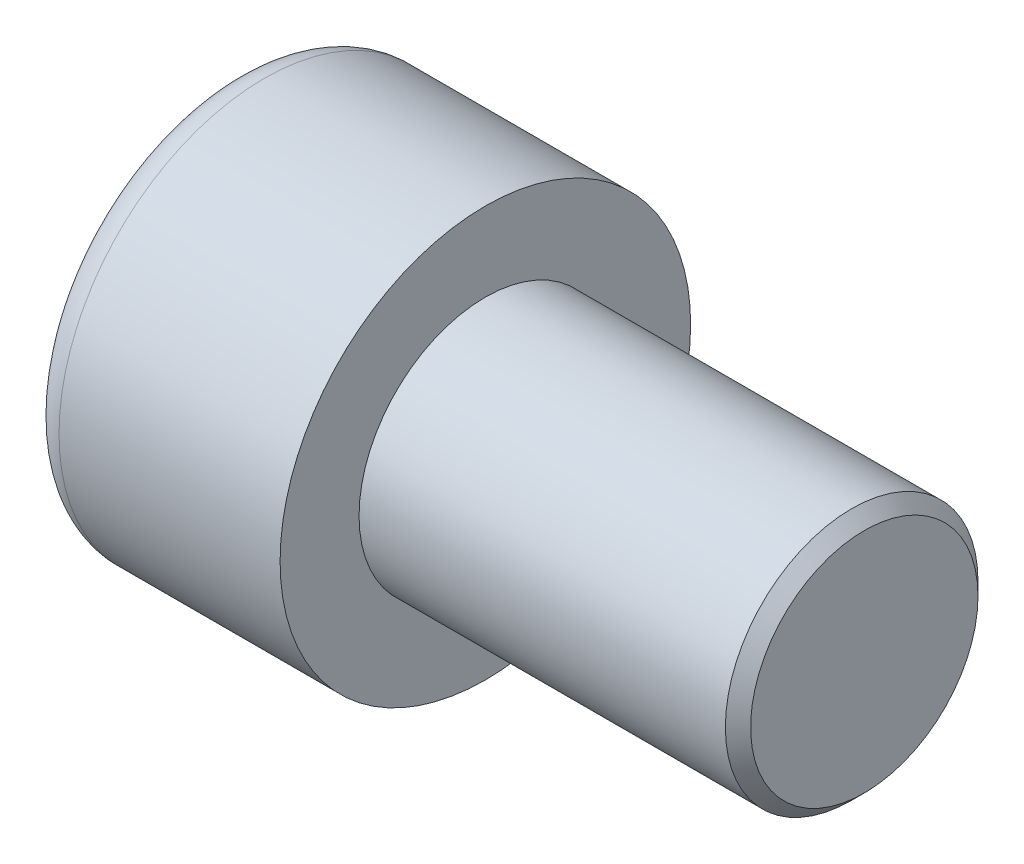
ISO-10303-21;
HEADER;
FILE_DESCRIPTION(('STEP AP214'),'2;1');
FILE_NAME('part.step','',(''),(''),'','','');
FILE_SCHEMA(('AUTOMOTIVE_DESIGN { 1 0 10303 214 1 1 1 1 }'));
ENDSEC;
DATA;
#1=APPLICATION_CONTEXT('core data for automotive mechanical design processes');
#2=APPLICATION_PROTOCOL_DEFINITION('international standard','automotive_design',2000,#1);
#3=PRODUCT_CONTEXT('',#1,'mechanical');
#4=PRODUCT('Part','Part','',(#3));
#5=PRODUCT_RELATED_PRODUCT_CATEGORY('part','',(#4));
#6=PRODUCT_DEFINITION_FORMATION('','',#4);
#7=PRODUCT_DEFINITION_CONTEXT('part definition',#1,'design');
#8=PRODUCT_DEFINITION('design','',#6,#7);
#9=PRODUCT_DEFINITION_SHAPE('','',#8);
#10=(LENGTH_UNIT() NAMED_UNIT(*) SI_UNIT(.MILLI.,.METRE.));
#11=(NAMED_UNIT(*) PLANE_ANGLE_UNIT() SI_UNIT($,.RADIAN.));
#12=(NAMED_UNIT(*) SI_UNIT($,.STERADIAN.) SOLID_ANGLE_UNIT());
#13=UNCERTAINTY_MEASURE_WITH_UNIT(LENGTH_MEASURE(1.E-05),#10,'distance_accuracy_value','');
#14=(GEOMETRIC_REPRESENTATION_CONTEXT(3) GLOBAL_UNCERTAINTY_ASSIGNED_CONTEXT((#13)) GLOBAL_UNIT_ASSIGNED_CONTEXT((#10,
#11,#12)) REPRESENTATION_CONTEXT('',''));
#15=CARTESIAN_POINT('',(0.,0.,0.));
#16=DIRECTION('',(0.,0.,1.));
#17=DIRECTION('',(1.,0.,0.));
#18=AXIS2_PLACEMENT_3D('',#15,#16,#17);
#19=CARTESIAN_POINT('',(4.,0.,-3.46410161513775));
#20=DIRECTION('',(1.,0.,0.));
#21=DIRECTION('',(0.,0.,-1.));
#22=AXIS2_PLACEMENT_3D('',#19,#20,#21);
#23=PLANE('',#22);
#24=CARTESIAN_POINT('',(4.,0.,0.));
#25=DIRECTION('',(1.,0.,0.));
#26=DIRECTION('',(0.,0.,-1.));
#27=AXIS2_PLACEMENT_3D('',#24,#25,#26);
#28=CIRCLE('',#27,3.);
#29=CARTESIAN_POINT('',(4.,-1.5,-2.59807621135332));
#30=VERTEX_POINT('',#29);
#31=CARTESIAN_POINT('',(4.,-3.,0.));
#32=VERTEX_POINT('',#31);
#33=EDGE_CURVE('E159',#30,#32,#28,.F.);
#34=ORIENTED_EDGE('',*,*,#33,.F.);
#35=DIRECTION('',(0.,0.866025403784439,-0.5));
#36=VECTOR('',#35,1.);
#37=CARTESIAN_POINT('',(4.,-3.,-1.73205080756887));
#38=LINE('',#37,#36);
#39=CARTESIAN_POINT('',(4.,-3.,-1.73205080756887));
#40=VERTEX_POINT('',#39);
#41=EDGE_CURVE('E167',#40,#30,#38,.T.);
#42=ORIENTED_EDGE('',*,*,#41,.F.);
#43=DIRECTION('',(0.,0.,-1.));
#44=VECTOR('',#43,1.);
#45=CARTESIAN_POINT('',(4.,-3.,1.73205080756888));
#46=LINE('',#45,#44);
#47=EDGE_CURVE('E184',#32,#40,#46,.T.);
#48=ORIENTED_EDGE('',*,*,#47,.F.);
#49=EDGE_LOOP('',(#34,#42,#48));
#50=FACE_BOUND('',#49,.T.);
#51=ADVANCED_FACE('F36',(#50),#23,.F.);
#52=CARTESIAN_POINT('',(4.,-1.5,2.59807621135331));
#53=VERTEX_POINT('',#52);
#54=EDGE_CURVE('E289',#32,#53,#28,.F.);
#55=ORIENTED_EDGE('',*,*,#54,.F.);
#56=CARTESIAN_POINT('',(4.,-3.,1.73205080756888));
#57=VERTEX_POINT('',#56);
#58=EDGE_CURVE('E185',#57,#32,#46,.T.);
#59=ORIENTED_EDGE('',*,*,#58,.F.);
#60=DIRECTION('',(0.,-0.866025403784438,-0.5));
#61=VECTOR('',#60,1.);
#62=CARTESIAN_POINT('',(4.,0.,3.46410161513776));
#63=LINE('',#62,#61);
#64=EDGE_CURVE('E180',#53,#57,#63,.T.);
#65=ORIENTED_EDGE('',*,*,#64,.F.);
#66=EDGE_LOOP('',(#55,#59,#65));
#67=FACE_BOUND('',#66,.T.);
#68=ADVANCED_FACE('F125',(#67),#23,.F.);
#69=CARTESIAN_POINT('',(4.,1.5,2.59807621135332));
#70=VERTEX_POINT('',#69);
#71=EDGE_CURVE('E285',#53,#70,#28,.F.);
#72=ORIENTED_EDGE('',*,*,#71,.F.);
#73=CARTESIAN_POINT('',(4.,0.,3.46410161513776));
#74=VERTEX_POINT('',#73);
#75=EDGE_CURVE('E181',#74,#53,#63,.T.);
#76=ORIENTED_EDGE('',*,*,#75,.F.);
#77=DIRECTION('',(0.,-0.866025403784439,0.5));
#78=VECTOR('',#77,1.);
#79=CARTESIAN_POINT('',(4.,3.,1.73205080756888));
#80=LINE('',#79,#78);
#81=EDGE_CURVE('E176',#70,#74,#80,.T.);
#82=ORIENTED_EDGE('',*,*,#81,.F.);
#83=EDGE_LOOP('',(#72,#76,#82));
#84=FACE_BOUND('',#83,.T.);
#85=ADVANCED_FACE('F131',(#84),#23,.F.);
#86=CARTESIAN_POINT('',(4.,3.,0.));
#87=VERTEX_POINT('',#86);
#88=EDGE_CURVE('E156',#70,#87,#28,.F.);
#89=ORIENTED_EDGE('',*,*,#88,.F.);
#90=CARTESIAN_POINT('',(4.,3.,1.73205080756888));
#91=VERTEX_POINT('',#90);
#92=EDGE_CURVE('E177',#91,#70,#80,.T.);
#93=ORIENTED_EDGE('',*,*,#92,.F.);
#94=DIRECTION('',(0.,0.,1.));
#95=VECTOR('',#94,1.);
#96=CARTESIAN_POINT('',(4.,3.,-1.73205080756887));
#97=LINE('',#96,#95);
#98=EDGE_CURVE('E171',#87,#91,#97,.T.);
#99=ORIENTED_EDGE('',*,*,#98,.F.);
#100=EDGE_LOOP('',(#89,#93,#99));
#101=FACE_BOUND('',#100,.T.);
#102=ADVANCED_FACE('F145',(#101),#23,.F.);
#103=CARTESIAN_POINT('',(4.,0.,0.));
#104=DIRECTION('',(1.,0.,0.));
#105=DIRECTION('',(0.,0.,-1.));
#106=AXIS2_PLACEMENT_3D('',#103,#104,#105);
#107=CIRCLE('',#106,3.);
#108=CARTESIAN_POINT('',(4.,1.5,-2.59807621135331));
#109=VERTEX_POINT('',#108);
#110=EDGE_CURVE('E51',#109,#87,#107,.T.);
#111=ORIENTED_EDGE('',*,*,#110,.T.);
#112=CARTESIAN_POINT('',(4.,3.,-1.73205080756887));
#113=VERTEX_POINT('',#112);
#114=EDGE_CURVE('E164',#113,#87,#97,.T.);
#115=ORIENTED_EDGE('',*,*,#114,.F.);
#116=DIRECTION('',(0.,0.866025403784438,0.5));
#117=VECTOR('',#116,1.);
#118=CARTESIAN_POINT('',(4.,0.,-3.46410161513775));
#119=LINE('',#118,#117);
#120=EDGE_CURVE('E161',#109,#113,#119,.T.);
#121=ORIENTED_EDGE('',*,*,#120,.F.);
#122=EDGE_LOOP('',(#111,#115,#121));
#123=FACE_BOUND('',#122,.T.);
#124=ADVANCED_FACE('F136',(#123),#23,.F.);
#125=EDGE_CURVE('E149',#109,#30,#28,.F.);
#126=ORIENTED_EDGE('',*,*,#125,.F.);
#127=CARTESIAN_POINT('',(4.,0.,-3.46410161513775));
#128=VERTEX_POINT('',#127);
#129=EDGE_CURVE('E152',#128,#109,#119,.T.);
#130=ORIENTED_EDGE('',*,*,#129,.F.);
#131=EDGE_CURVE('E154',#30,#128,#38,.T.);
#132=ORIENTED_EDGE('',*,*,#131,.F.);
#133=EDGE_LOOP('',(#126,#130,#132));
#134=FACE_BOUND('',#133,.T.);
#135=ADVANCED_FACE('F127',(#134),#23,.F.);
#136=CARTESIAN_POINT('',(0.,0.,0.));
#137=DIRECTION('',(1.,0.,0.));
#138=DIRECTION('',(0.,0.,-1.));
#139=AXIS2_PLACEMENT_3D('',#136,#137,#138);
#140=PLANE('',#139);
#141=CARTESIAN_POINT('',(0.,0.,0.));
#142=DIRECTION('',(1.,0.,0.));
#143=DIRECTION('',(0.,0.,-1.));
#144=AXIS2_PLACEMENT_3D('',#141,#142,#143);
#145=CIRCLE('',#144,5.5);
#146=CARTESIAN_POINT('',(0.,0.,-5.5));
#147=VERTEX_POINT('',#146);
#148=EDGE_CURVE('E224',#147,#147,#145,.F.);
#149=ORIENTED_EDGE('',*,*,#148,.T.);
#150=EDGE_LOOP('',(#149));
#151=FACE_BOUND('',#150,.T.);
#152=DIRECTION('',(0.,0.866025403784439,-0.5));
#153=VECTOR('',#152,1.);
#154=CARTESIAN_POINT('',(0.,-3.,-1.73205080756887));
#155=LINE('',#154,#153);
#156=CARTESIAN_POINT('',(0.,-3.,-1.73205080756887));
#157=VERTEX_POINT('',#156);
#158=CARTESIAN_POINT('',(0.,0.,-3.46410161513775));
#159=VERTEX_POINT('',#158);
#160=EDGE_CURVE('E59',#157,#159,#155,.T.);
#161=ORIENTED_EDGE('',*,*,#160,.T.);
#162=DIRECTION('',(0.,0.866025403784438,0.5));
#163=VECTOR('',#162,1.);
#164=CARTESIAN_POINT('',(0.,0.,-3.46410161513775));
#165=LINE('',#164,#163);
#166=CARTESIAN_POINT('',(0.,3.,-1.73205080756887));
#167=VERTEX_POINT('',#166);
#168=EDGE_CURVE('E190',#159,#167,#165,.T.);
#169=ORIENTED_EDGE('',*,*,#168,.T.);
#170=DIRECTION('',(0.,0.,1.));
#171=VECTOR('',#170,1.);
#172=CARTESIAN_POINT('',(0.,3.,-1.73205080756887));
#173=LINE('',#172,#171);
#174=CARTESIAN_POINT('',(0.,3.,1.73205080756888));
#175=VERTEX_POINT('',#174);
#176=EDGE_CURVE('E193',#167,#175,#173,.T.);
#177=ORIENTED_EDGE('',*,*,#176,.T.);
#178=DIRECTION('',(0.,-0.866025403784439,0.5));
#179=VECTOR('',#178,1.);
#180=CARTESIAN_POINT('',(0.,3.,1.73205080756888));
#181=LINE('',#180,#179);
#182=CARTESIAN_POINT('',(0.,0.,3.46410161513776));
#183=VERTEX_POINT('',#182);
#184=EDGE_CURVE('E196',#175,#183,#181,.T.);
#185=ORIENTED_EDGE('',*,*,#184,.T.);
#186=DIRECTION('',(0.,-0.866025403784438,-0.5));
#187=VECTOR('',#186,1.);
#188=CARTESIAN_POINT('',(0.,0.,3.46410161513776));
#189=LINE('',#188,#187);
#190=CARTESIAN_POINT('',(0.,-3.,1.73205080756888));
#191=VERTEX_POINT('',#190);
#192=EDGE_CURVE('E199',#183,#191,#189,.T.);
#193=ORIENTED_EDGE('',*,*,#192,.T.);
#194=DIRECTION('',(0.,0.,-1.));
#195=VECTOR('',#194,1.);
#196=CARTESIAN_POINT('',(0.,-3.,1.73205080756888));
#197=LINE('',#196,#195);
#198=EDGE_CURVE('E202',#191,#157,#197,.T.);
#199=ORIENTED_EDGE('',*,*,#198,.T.);
#200=EDGE_LOOP('',(#161,#169,#177,#185,#193,#199));
#201=FACE_BOUND('',#200,.T.);
#202=ADVANCED_FACE('F135',(#151,#201),#140,.F.);
#203=CARTESIAN_POINT('',(8.,0.,0.));
#204=DIRECTION('',(1.,0.,0.));
#205=DIRECTION('',(0.,0.,-1.));
#206=AXIS2_PLACEMENT_3D('',#203,#204,#205);
#207=PLANE('',#206);
#208=CARTESIAN_POINT('',(8.,0.,0.));
#209=DIRECTION('',(1.,0.,0.));
#210=DIRECTION('',(0.,0.,-1.));
#211=AXIS2_PLACEMENT_3D('',#208,#209,#210);
#212=CIRCLE('',#211,6.5);
#213=CARTESIAN_POINT('',(8.,0.,-6.5));
#214=VERTEX_POINT('',#213);
#215=EDGE_CURVE('E157',#214,#214,#212,.T.);
#216=ORIENTED_EDGE('',*,*,#215,.T.);
#217=EDGE_LOOP('',(#216));
#218=FACE_BOUND('',#217,.T.);
#219=CARTESIAN_POINT('',(8.,0.,0.));
#220=DIRECTION('',(1.,0.,0.));
#221=DIRECTION('',(0.,0.,-1.));
#222=AXIS2_PLACEMENT_3D('',#219,#220,#221);
#223=CIRCLE('',#222,4.);
#224=CARTESIAN_POINT('',(8.,0.,-4.));
#225=VERTEX_POINT('',#224);
#226=EDGE_CURVE('E215',#225,#225,#223,.T.);
#227=ORIENTED_EDGE('',*,*,#226,.F.);
#228=EDGE_LOOP('',(#227));
#229=FACE_BOUND('',#228,.T.);
#230=ADVANCED_FACE('F142',(#218,#229),#207,.T.);
#231=CARTESIAN_POINT('',(8.,0.,0.));
#232=DIRECTION('',(-1.,0.,0.));
#233=DIRECTION('',(0.,0.,1.));
#234=AXIS2_PLACEMENT_3D('',#231,#232,#233);
#235=CYLINDRICAL_SURFACE('',#234,6.5);
#236=CARTESIAN_POINT('',(1.,0.,0.));
#237=DIRECTION('',(1.,0.,0.));
#238=DIRECTION('',(0.,0.,-1.));
#239=AXIS2_PLACEMENT_3D('',#236,#237,#238);
#240=CIRCLE('',#239,6.5);
#241=CARTESIAN_POINT('',(1.,0.,-6.5));
#242=VERTEX_POINT('',#241);
#243=EDGE_CURVE('E221',#242,#242,#240,.T.);
#244=ORIENTED_EDGE('',*,*,#243,.T.);
#245=EDGE_LOOP('',(#244));
#246=FACE_BOUND('',#245,.T.);
#247=ORIENTED_EDGE('',*,*,#215,.F.);
#248=EDGE_LOOP('',(#247));
#249=FACE_BOUND('',#248,.T.);
#250=ADVANCED_FACE('F240',(#246,#249),#235,.T.);
#251=CARTESIAN_POINT('',(20.,0.,0.));
#252=DIRECTION('',(-1.,0.,0.));
#253=DIRECTION('',(0.,0.,1.));
#254=AXIS2_PLACEMENT_3D('',#251,#252,#253);
#255=CYLINDRICAL_SURFACE('',#254,4.);
#256=CARTESIAN_POINT('',(19.6,0.,0.));
#257=DIRECTION('',(1.,0.,0.));
#258=DIRECTION('',(0.,0.,-1.));
#259=AXIS2_PLACEMENT_3D('',#256,#257,#258);
#260=CIRCLE('',#259,4.);
#261=CARTESIAN_POINT('',(19.6,0.,-4.));
#262=VERTEX_POINT('',#261);
#263=EDGE_CURVE('E11',#262,#262,#260,.F.);
#264=ORIENTED_EDGE('',*,*,#263,.T.);
#265=EDGE_LOOP('',(#264));
#266=FACE_BOUND('',#265,.T.);
#267=ORIENTED_EDGE('',*,*,#226,.T.);
#268=EDGE_LOOP('',(#267));
#269=FACE_BOUND('',#268,.T.);
#270=ADVANCED_FACE('F237',(#266,#269),#255,.T.);
#271=CARTESIAN_POINT('',(20.,0.,0.));
#272=DIRECTION('',(1.,0.,0.));
#273=DIRECTION('',(0.,0.,-1.));
#274=AXIS2_PLACEMENT_3D('',#271,#272,#273);
#275=PLANE('',#274);
#276=CARTESIAN_POINT('',(20.,0.,0.));
#277=DIRECTION('',(1.,0.,0.));
#278=DIRECTION('',(0.,0.,-1.));
#279=AXIS2_PLACEMENT_3D('',#276,#277,#278);
#280=CIRCLE('',#279,3.6);
#281=CARTESIAN_POINT('',(20.,0.,-3.6));
#282=VERTEX_POINT('',#281);
#283=EDGE_CURVE('E44',#282,#282,#280,.T.);
#284=ORIENTED_EDGE('',*,*,#283,.T.);
#285=EDGE_LOOP('',(#284));
#286=FACE_BOUND('',#285,.T.);
#287=ADVANCED_FACE('F229',(#286),#275,.T.);
#288=CARTESIAN_POINT('',(4.,-3.,-1.73205080756887));
#289=DIRECTION('',(0.,0.5,0.866025403784439));
#290=DIRECTION('',(0.,-0.866025403784439,0.5));
#291=AXIS2_PLACEMENT_3D('',#288,#289,#290);
#292=PLANE('',#291);
#293=ORIENTED_EDGE('',*,*,#160,.F.);
#294=DIRECTION('',(-1.,0.,0.));
#295=VECTOR('',#294,1.);
#296=CARTESIAN_POINT('',(4.,-3.,-1.73205080756887));
#297=LINE('',#296,#295);
#298=EDGE_CURVE('E188',#40,#157,#297,.T.);
#299=ORIENTED_EDGE('',*,*,#298,.F.);
#300=ORIENTED_EDGE('',*,*,#41,.T.);
#301=ORIENTED_EDGE('',*,*,#131,.T.);
#302=DIRECTION('',(-1.,0.,0.));
#303=VECTOR('',#302,1.);
#304=CARTESIAN_POINT('',(4.,0.,-3.46410161513775));
#305=LINE('',#304,#303);
#306=EDGE_CURVE('E170',#128,#159,#305,.T.);
#307=ORIENTED_EDGE('',*,*,#306,.T.);
#308=EDGE_LOOP('',(#293,#299,#300,#301,#307));
#309=FACE_BOUND('',#308,.T.);
#310=ADVANCED_FACE('F255',(#309),#292,.T.);
#311=CARTESIAN_POINT('',(4.,0.,-3.46410161513775));
#312=DIRECTION('',(0.,-0.5,0.866025403784438));
#313=DIRECTION('',(0.,-0.866025403784438,-0.5));
#314=AXIS2_PLACEMENT_3D('',#311,#312,#313);
#315=PLANE('',#314);
#316=ORIENTED_EDGE('',*,*,#168,.F.);
#317=ORIENTED_EDGE('',*,*,#306,.F.);
#318=ORIENTED_EDGE('',*,*,#129,.T.);
#319=ORIENTED_EDGE('',*,*,#120,.T.);
#320=DIRECTION('',(-1.,0.,0.));
#321=VECTOR('',#320,1.);
#322=CARTESIAN_POINT('',(4.,3.,-1.73205080756887));
#323=LINE('',#322,#321);
#324=EDGE_CURVE('E212',#113,#167,#323,.T.);
#325=ORIENTED_EDGE('',*,*,#324,.T.);
#326=EDGE_LOOP('',(#316,#317,#318,#319,#325));
#327=FACE_BOUND('',#326,.T.);
#328=ADVANCED_FACE('F169',(#327),#315,.T.);
#329=CARTESIAN_POINT('',(4.,3.,-1.73205080756887));
#330=DIRECTION('',(0.,-1.,0.));
#331=DIRECTION('',(0.,0.,-1.));
#332=AXIS2_PLACEMENT_3D('',#329,#330,#331);
#333=PLANE('',#332);
#334=ORIENTED_EDGE('',*,*,#176,.F.);
#335=ORIENTED_EDGE('',*,*,#324,.F.);
#336=ORIENTED_EDGE('',*,*,#114,.T.);
#337=ORIENTED_EDGE('',*,*,#98,.T.);
#338=DIRECTION('',(-1.,0.,0.));
#339=VECTOR('',#338,1.);
#340=CARTESIAN_POINT('',(4.,3.,1.73205080756888));
#341=LINE('',#340,#339);
#342=EDGE_CURVE('E210',#91,#175,#341,.T.);
#343=ORIENTED_EDGE('',*,*,#342,.T.);
#344=EDGE_LOOP('',(#334,#335,#336,#337,#343));
#345=FACE_BOUND('',#344,.T.);
#346=ADVANCED_FACE('F260',(#345),#333,.T.);
#347=CARTESIAN_POINT('',(4.,3.,1.73205080756888));
#348=DIRECTION('',(0.,-0.5,-0.866025403784439));
#349=DIRECTION('',(0.,0.866025403784439,-0.5));
#350=AXIS2_PLACEMENT_3D('',#347,#348,#349);
#351=PLANE('',#350);
#352=ORIENTED_EDGE('',*,*,#184,.F.);
#353=ORIENTED_EDGE('',*,*,#342,.F.);
#354=ORIENTED_EDGE('',*,*,#92,.T.);
#355=ORIENTED_EDGE('',*,*,#81,.T.);
#356=DIRECTION('',(-1.,0.,0.));
#357=VECTOR('',#356,1.);
#358=CARTESIAN_POINT('',(4.,0.,3.46410161513776));
#359=LINE('',#358,#357);
#360=EDGE_CURVE('E208',#74,#183,#359,.T.);
#361=ORIENTED_EDGE('',*,*,#360,.T.);
#362=EDGE_LOOP('',(#352,#353,#354,#355,#361));
#363=FACE_BOUND('',#362,.T.);
#364=ADVANCED_FACE('F263',(#363),#351,.T.);
#365=CARTESIAN_POINT('',(4.,0.,3.46410161513776));
#366=DIRECTION('',(0.,0.5,-0.866025403784438));
#367=DIRECTION('',(0.,0.866025403784438,0.5));
#368=AXIS2_PLACEMENT_3D('',#365,#366,#367);
#369=PLANE('',#368);
#370=ORIENTED_EDGE('',*,*,#192,.F.);
#371=ORIENTED_EDGE('',*,*,#360,.F.);
#372=ORIENTED_EDGE('',*,*,#75,.T.);
#373=ORIENTED_EDGE('',*,*,#64,.T.);
#374=DIRECTION('',(-1.,0.,0.));
#375=VECTOR('',#374,1.);
#376=CARTESIAN_POINT('',(4.,-3.,1.73205080756888));
#377=LINE('',#376,#375);
#378=EDGE_CURVE('E206',#57,#191,#377,.T.);
#379=ORIENTED_EDGE('',*,*,#378,.T.);
#380=EDGE_LOOP('',(#370,#371,#372,#373,#379));
#381=FACE_BOUND('',#380,.T.);
#382=ADVANCED_FACE('F120',(#381),#369,.T.);
#383=CARTESIAN_POINT('',(4.,-3.,1.73205080756888));
#384=DIRECTION('',(0.,1.,0.));
#385=DIRECTION('',(0.,0.,1.));
#386=AXIS2_PLACEMENT_3D('',#383,#384,#385);
#387=PLANE('',#386);
#388=ORIENTED_EDGE('',*,*,#198,.F.);
#389=ORIENTED_EDGE('',*,*,#378,.F.);
#390=ORIENTED_EDGE('',*,*,#58,.T.);
#391=ORIENTED_EDGE('',*,*,#47,.T.);
#392=ORIENTED_EDGE('',*,*,#298,.T.);
#393=EDGE_LOOP('',(#388,#389,#390,#391,#392));
#394=FACE_BOUND('',#393,.T.);
#395=ADVANCED_FACE('F113',(#394),#387,.T.);
#396=CARTESIAN_POINT('',(4.,0.,0.));
#397=DIRECTION('',(-1.,0.,0.));
#398=DIRECTION('',(0.,0.,1.));
#399=AXIS2_PLACEMENT_3D('',#396,#397,#398);
#400=CONICAL_SURFACE('',#399,3.,1.04719755119659);
#401=CARTESIAN_POINT('',(5.7320508075689,0.,0.));
#402=VERTEX_POINT('',#401);
#403=VERTEX_LOOP('',#402);
#404=FACE_BOUND('',#403,.T.);
#405=ORIENTED_EDGE('',*,*,#110,.F.);
#406=ORIENTED_EDGE('',*,*,#125,.T.);
#407=ORIENTED_EDGE('',*,*,#33,.T.);
#408=ORIENTED_EDGE('',*,*,#54,.T.);
#409=ORIENTED_EDGE('',*,*,#71,.T.);
#410=ORIENTED_EDGE('',*,*,#88,.T.);
#411=EDGE_LOOP('',(#405,#406,#407,#408,#409,#410));
#412=FACE_BOUND('',#411,.T.);
#413=ADVANCED_FACE('F110',(#404,#412),#400,.F.);
#414=CARTESIAN_POINT('',(1.,0.,0.));
#415=DIRECTION('',(1.,0.,0.));
#416=DIRECTION('',(0.,0.,-1.));
#417=AXIS2_PLACEMENT_3D('',#414,#415,#416);
#418=TOROIDAL_SURFACE('',#417,5.5,1.);
#419=ORIENTED_EDGE('',*,*,#148,.F.);
#420=EDGE_LOOP('',(#419));
#421=FACE_BOUND('',#420,.T.);
#422=ORIENTED_EDGE('',*,*,#243,.F.);
#423=EDGE_LOOP('',(#422));
#424=FACE_BOUND('',#423,.T.);
#425=ADVANCED_FACE('F112',(#421,#424),#418,.T.);
#426=CARTESIAN_POINT('',(20.,0.,0.));
#427=DIRECTION('',(-1.,0.,0.));
#428=DIRECTION('',(0.,0.,1.));
#429=AXIS2_PLACEMENT_3D('',#426,#427,#428);
#430=CONICAL_SURFACE('',#429,3.6,0.785398163397448);
#431=ORIENTED_EDGE('',*,*,#263,.F.);
#432=EDGE_LOOP('',(#431));
#433=FACE_BOUND('',#432,.T.);
#434=ORIENTED_EDGE('',*,*,#283,.F.);
#435=EDGE_LOOP('',(#434));
#436=FACE_BOUND('',#435,.T.);
#437=ADVANCED_FACE('F38',(#433,#436),#430,.T.);
#438=CLOSED_SHELL('',(#51,#68,#85,#102,#124,#135,#202,#230,#250,#270,#287,#310,#328,#346,#364,
#382,#395,#413,#425,#437));
#439=MANIFOLD_SOLID_BREP('B2',#438);
#440=ADVANCED_BREP_SHAPE_REPRESENTATION('',(#18,#439),#14);
#441=SHAPE_DEFINITION_REPRESENTATION(#9,#440);
ENDSEC;
END-ISO-10303-21;
